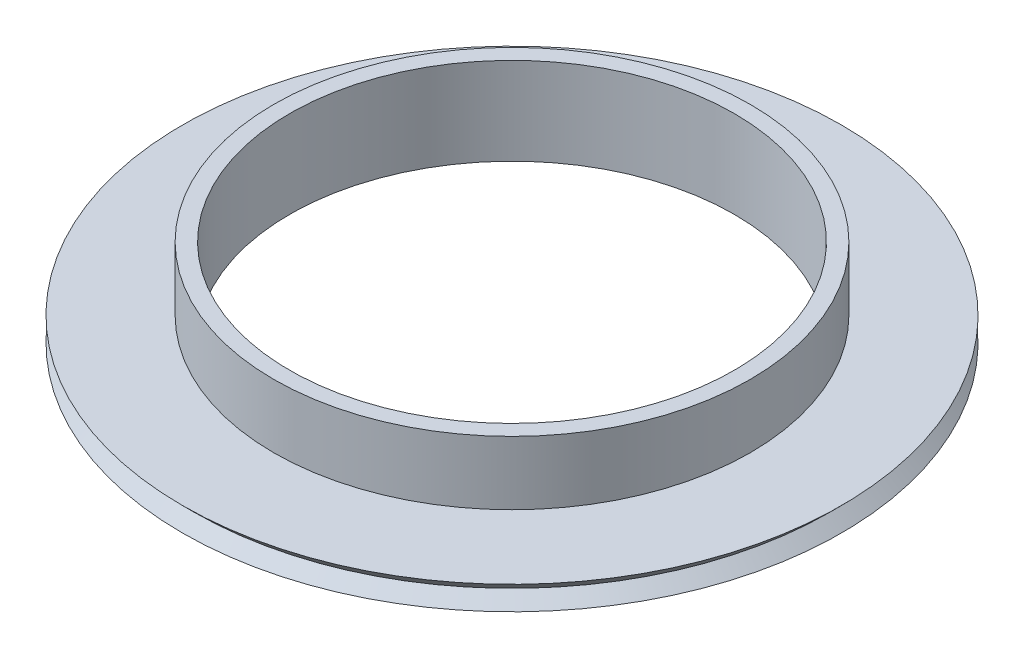
ISO-10303-21;
HEADER;
FILE_DESCRIPTION(('STEP AP214'),'2;1');
FILE_NAME('part.step','',(''),(''),'','','');
FILE_SCHEMA(('AUTOMOTIVE_DESIGN { 1 0 10303 214 1 1 1 1 }'));
ENDSEC;
DATA;
#1=APPLICATION_CONTEXT('core data for automotive mechanical design processes');
#2=APPLICATION_PROTOCOL_DEFINITION('international standard','automotive_design',2000,#1);
#3=PRODUCT_CONTEXT('',#1,'mechanical');
#4=PRODUCT('Part','Part','',(#3));
#5=PRODUCT_RELATED_PRODUCT_CATEGORY('part','',(#4));
#6=PRODUCT_DEFINITION_FORMATION('','',#4);
#7=PRODUCT_DEFINITION_CONTEXT('part definition',#1,'design');
#8=PRODUCT_DEFINITION('design','',#6,#7);
#9=PRODUCT_DEFINITION_SHAPE('','',#8);
#10=(LENGTH_UNIT() NAMED_UNIT(*) SI_UNIT(.MILLI.,.METRE.));
#11=(NAMED_UNIT(*) PLANE_ANGLE_UNIT() SI_UNIT($,.RADIAN.));
#12=(NAMED_UNIT(*) SI_UNIT($,.STERADIAN.) SOLID_ANGLE_UNIT());
#13=UNCERTAINTY_MEASURE_WITH_UNIT(LENGTH_MEASURE(1.E-05),#10,'distance_accuracy_value','');
#14=(GEOMETRIC_REPRESENTATION_CONTEXT(3) GLOBAL_UNCERTAINTY_ASSIGNED_CONTEXT((#13)) GLOBAL_UNIT_ASSIGNED_CONTEXT((#10,
#11,#12)) REPRESENTATION_CONTEXT('',''));
#15=CARTESIAN_POINT('',(0.,0.,0.));
#16=DIRECTION('',(0.,0.,1.));
#17=DIRECTION('',(1.,0.,0.));
#18=AXIS2_PLACEMENT_3D('',#15,#16,#17);
#19=CARTESIAN_POINT('',(-28.,0.,0.));
#20=DIRECTION('',(0.,1.,0.));
#21=DIRECTION('',(0.,0.,1.));
#22=AXIS2_PLACEMENT_3D('',#19,#20,#21);
#23=PLANE('',#22);
#24=CARTESIAN_POINT('',(0.,0.,0.));
#25=DIRECTION('',(0.,-1.,0.));
#26=DIRECTION('',(0.,0.,-1.));
#27=AXIS2_PLACEMENT_3D('',#24,#25,#26);
#28=CIRCLE('',#27,28.);
#29=CARTESIAN_POINT('',(0.,0.,-28.));
#30=VERTEX_POINT('',#29);
#31=EDGE_CURVE('E10',#30,#30,#28,.T.);
#32=ORIENTED_EDGE('',*,*,#31,.F.);
#33=EDGE_LOOP('',(#32));
#34=FACE_BOUND('',#33,.T.);
#35=CARTESIAN_POINT('',(0.,0.,0.));
#36=DIRECTION('',(0.,-1.,0.));
#37=DIRECTION('',(0.,0.,-1.));
#38=AXIS2_PLACEMENT_3D('',#35,#36,#37);
#39=CIRCLE('',#38,41.5);
#40=CARTESIAN_POINT('',(0.,0.,-41.5));
#41=VERTEX_POINT('',#40);
#42=EDGE_CURVE('E68',#41,#41,#39,.T.);
#43=ORIENTED_EDGE('',*,*,#42,.T.);
#44=EDGE_LOOP('',(#43));
#45=FACE_BOUND('',#44,.T.);
#46=ADVANCED_FACE('F37',(#34,#45),#23,.F.);
#47=CARTESIAN_POINT('',(0.,0.,0.));
#48=DIRECTION('',(0.,-1.,0.));
#49=DIRECTION('',(0.,0.,-1.));
#50=AXIS2_PLACEMENT_3D('',#47,#48,#49);
#51=CYLINDRICAL_SURFACE('',#50,28.);
#52=CARTESIAN_POINT('',(0.,11.,0.));
#53=DIRECTION('',(0.,-1.,0.));
#54=DIRECTION('',(0.,0.,-1.));
#55=AXIS2_PLACEMENT_3D('',#52,#53,#54);
#56=CIRCLE('',#55,28.);
#57=CARTESIAN_POINT('',(0.,11.,-28.));
#58=VERTEX_POINT('',#57);
#59=EDGE_CURVE('E44',#58,#58,#56,.T.);
#60=ORIENTED_EDGE('',*,*,#59,.F.);
#61=EDGE_LOOP('',(#60));
#62=FACE_BOUND('',#61,.T.);
#63=ORIENTED_EDGE('',*,*,#31,.T.);
#64=EDGE_LOOP('',(#63));
#65=FACE_BOUND('',#64,.T.);
#66=ADVANCED_FACE('F100',(#62,#65),#51,.F.);
#67=CARTESIAN_POINT('',(-28.,11.,0.));
#68=DIRECTION('',(0.,-1.,0.));
#69=DIRECTION('',(0.,0.,-1.));
#70=AXIS2_PLACEMENT_3D('',#67,#68,#69);
#71=PLANE('',#70);
#72=CARTESIAN_POINT('',(0.,11.,0.));
#73=DIRECTION('',(0.,-1.,0.));
#74=DIRECTION('',(0.,0.,-1.));
#75=AXIS2_PLACEMENT_3D('',#72,#73,#74);
#76=CIRCLE('',#75,30.);
#77=CARTESIAN_POINT('',(0.,11.,-30.));
#78=VERTEX_POINT('',#77);
#79=EDGE_CURVE('E49',#78,#78,#76,.T.);
#80=ORIENTED_EDGE('',*,*,#79,.F.);
#81=EDGE_LOOP('',(#80));
#82=FACE_BOUND('',#81,.T.);
#83=ORIENTED_EDGE('',*,*,#59,.T.);
#84=EDGE_LOOP('',(#83));
#85=FACE_BOUND('',#84,.T.);
#86=ADVANCED_FACE('F95',(#82,#85),#71,.F.);
#87=CARTESIAN_POINT('',(0.,0.,0.));
#88=DIRECTION('',(0.,-1.,0.));
#89=DIRECTION('',(0.,0.,-1.));
#90=AXIS2_PLACEMENT_3D('',#87,#88,#89);
#91=CYLINDRICAL_SURFACE('',#90,30.);
#92=CARTESIAN_POINT('',(0.,3.00000000000002,0.));
#93=DIRECTION('',(0.,-1.,0.));
#94=DIRECTION('',(0.,0.,-1.));
#95=AXIS2_PLACEMENT_3D('',#92,#93,#94);
#96=CIRCLE('',#95,30.);
#97=CARTESIAN_POINT('',(0.,3.00000000000002,-30.));
#98=VERTEX_POINT('',#97);
#99=EDGE_CURVE('E54',#98,#98,#96,.T.);
#100=ORIENTED_EDGE('',*,*,#99,.F.);
#101=EDGE_LOOP('',(#100));
#102=FACE_BOUND('',#101,.T.);
#103=ORIENTED_EDGE('',*,*,#79,.T.);
#104=EDGE_LOOP('',(#103));
#105=FACE_BOUND('',#104,.T.);
#106=ADVANCED_FACE('F89',(#102,#105),#91,.T.);
#107=CARTESIAN_POINT('',(-41.5,3.00000000000001,0.));
#108=DIRECTION('',(0.,-1.,0.));
#109=DIRECTION('',(0.,0.,-1.));
#110=AXIS2_PLACEMENT_3D('',#107,#108,#109);
#111=PLANE('',#110);
#112=CARTESIAN_POINT('',(0.,2.99999999999999,0.));
#113=DIRECTION('',(0.,-1.,0.));
#114=DIRECTION('',(0.,0.,-1.));
#115=AXIS2_PLACEMENT_3D('',#112,#113,#114);
#116=CIRCLE('',#115,41.5);
#117=CARTESIAN_POINT('',(0.,2.99999999999999,-41.5));
#118=VERTEX_POINT('',#117);
#119=EDGE_CURVE('E60',#118,#118,#116,.T.);
#120=ORIENTED_EDGE('',*,*,#119,.F.);
#121=EDGE_LOOP('',(#120));
#122=FACE_BOUND('',#121,.T.);
#123=ORIENTED_EDGE('',*,*,#99,.T.);
#124=EDGE_LOOP('',(#123));
#125=FACE_BOUND('',#124,.T.);
#126=ADVANCED_FACE('F83',(#122,#125),#111,.F.);
#127=CARTESIAN_POINT('',(0.,2.99999999999999,0.));
#128=DIRECTION('',(0.,1.,0.));
#129=DIRECTION('',(0.,0.,1.));
#130=AXIS2_PLACEMENT_3D('',#127,#128,#129);
#131=CONICAL_SURFACE('',#130,41.5,0.785398163397451);
#132=CARTESIAN_POINT('',(0.,1.5,0.));
#133=DIRECTION('',(0.,-1.,0.));
#134=DIRECTION('',(0.,0.,-1.));
#135=AXIS2_PLACEMENT_3D('',#132,#133,#134);
#136=CIRCLE('',#135,40.);
#137=CARTESIAN_POINT('',(0.,1.5,-40.));
#138=VERTEX_POINT('',#137);
#139=EDGE_CURVE('E64',#138,#138,#136,.T.);
#140=ORIENTED_EDGE('',*,*,#139,.F.);
#141=EDGE_LOOP('',(#140));
#142=FACE_BOUND('',#141,.T.);
#143=ORIENTED_EDGE('',*,*,#119,.T.);
#144=EDGE_LOOP('',(#143));
#145=FACE_BOUND('',#144,.T.);
#146=ADVANCED_FACE('F77',(#142,#145),#131,.T.);
#147=CARTESIAN_POINT('',(0.,1.5,0.));
#148=DIRECTION('',(0.,-1.,0.));
#149=DIRECTION('',(0.,0.,-1.));
#150=AXIS2_PLACEMENT_3D('',#147,#148,#149);
#151=CONICAL_SURFACE('',#150,40.,0.785398163397445);
#152=ORIENTED_EDGE('',*,*,#42,.F.);
#153=EDGE_LOOP('',(#152));
#154=FACE_BOUND('',#153,.T.);
#155=ORIENTED_EDGE('',*,*,#139,.T.);
#156=EDGE_LOOP('',(#155));
#157=FACE_BOUND('',#156,.T.);
#158=ADVANCED_FACE('F74',(#154,#157),#151,.T.);
#159=CLOSED_SHELL('',(#46,#66,#86,#106,#126,#146,#158));
#160=MANIFOLD_SOLID_BREP('B2',#159);
#161=ADVANCED_BREP_SHAPE_REPRESENTATION('',(#18,#160),#14);
#162=SHAPE_DEFINITION_REPRESENTATION(#9,#161);
ENDSEC;
END-ISO-10303-21;
